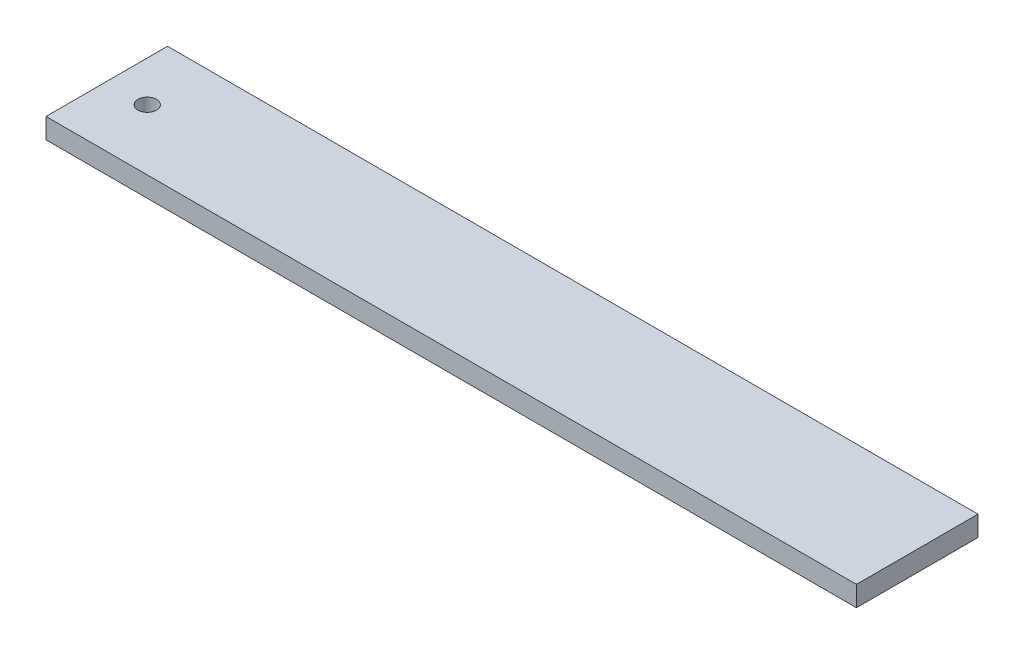
ISO-10303-21;
HEADER;
FILE_DESCRIPTION(('STEP AP214'),'2;1');
FILE_NAME('part.step','',(''),(''),'','','');
FILE_SCHEMA(('AUTOMOTIVE_DESIGN { 1 0 10303 214 1 1 1 1 }'));
ENDSEC;
DATA;
#1=APPLICATION_CONTEXT('core data for automotive mechanical design processes');
#2=APPLICATION_PROTOCOL_DEFINITION('international standard','automotive_design',2000,#1);
#3=PRODUCT_CONTEXT('',#1,'mechanical');
#4=PRODUCT('Part','Part','',(#3));
#5=PRODUCT_RELATED_PRODUCT_CATEGORY('part','',(#4));
#6=PRODUCT_DEFINITION_FORMATION('','',#4);
#7=PRODUCT_DEFINITION_CONTEXT('part definition',#1,'design');
#8=PRODUCT_DEFINITION('design','',#6,#7);
#9=PRODUCT_DEFINITION_SHAPE('','',#8);
#10=(LENGTH_UNIT() NAMED_UNIT(*) SI_UNIT(.MILLI.,.METRE.));
#11=(NAMED_UNIT(*) PLANE_ANGLE_UNIT() SI_UNIT($,.RADIAN.));
#12=(NAMED_UNIT(*) SI_UNIT($,.STERADIAN.) SOLID_ANGLE_UNIT());
#13=UNCERTAINTY_MEASURE_WITH_UNIT(LENGTH_MEASURE(1.E-05),#10,'distance_accuracy_value','');
#14=(GEOMETRIC_REPRESENTATION_CONTEXT(3) GLOBAL_UNCERTAINTY_ASSIGNED_CONTEXT((#13)) GLOBAL_UNIT_ASSIGNED_CONTEXT((#10,
#11,#12)) REPRESENTATION_CONTEXT('',''));
#15=CARTESIAN_POINT('',(0.,0.,0.));
#16=DIRECTION('',(0.,0.,1.));
#17=DIRECTION('',(1.,0.,0.));
#18=AXIS2_PLACEMENT_3D('',#15,#16,#17);
#19=CARTESIAN_POINT('',(0.,3.175,0.));
#20=DIRECTION('',(0.,-1.,0.));
#21=DIRECTION('',(0.,0.,-1.));
#22=AXIS2_PLACEMENT_3D('',#19,#20,#21);
#23=PLANE('',#22);
#24=DIRECTION('',(0.,0.,1.));
#25=VECTOR('',#24,1.);
#26=CARTESIAN_POINT('',(0.,3.175,0.));
#27=LINE('',#26,#25);
#28=CARTESIAN_POINT('',(0.,3.175,-19.05));
#29=VERTEX_POINT('',#28);
#30=CARTESIAN_POINT('',(0.,3.175,0.));
#31=VERTEX_POINT('',#30);
#32=EDGE_CURVE('E91',#29,#31,#27,.T.);
#33=ORIENTED_EDGE('',*,*,#32,.T.);
#34=DIRECTION('',(1.,0.,0.));
#35=VECTOR('',#34,1.);
#36=CARTESIAN_POINT('',(0.,3.175,0.));
#37=LINE('',#36,#35);
#38=CARTESIAN_POINT('',(127.,3.175,0.));
#39=VERTEX_POINT('',#38);
#40=EDGE_CURVE('E86',#31,#39,#37,.T.);
#41=ORIENTED_EDGE('',*,*,#40,.T.);
#42=DIRECTION('',(0.,0.,-1.));
#43=VECTOR('',#42,1.);
#44=CARTESIAN_POINT('',(127.,3.175,0.));
#45=LINE('',#44,#43);
#46=CARTESIAN_POINT('',(127.,3.175,-19.05));
#47=VERTEX_POINT('',#46);
#48=EDGE_CURVE('E89',#39,#47,#45,.T.);
#49=ORIENTED_EDGE('',*,*,#48,.T.);
#50=DIRECTION('',(-1.,0.,0.));
#51=VECTOR('',#50,1.);
#52=CARTESIAN_POINT('',(0.,3.175,-19.05));
#53=LINE('',#52,#51);
#54=EDGE_CURVE('E56',#47,#29,#53,.T.);
#55=ORIENTED_EDGE('',*,*,#54,.T.);
#56=EDGE_LOOP('',(#33,#41,#49,#55));
#57=FACE_BOUND('',#56,.T.);
#58=CARTESIAN_POINT('',(6.35,3.175,-9.525));
#59=DIRECTION('',(0.,1.,0.));
#60=DIRECTION('',(0.,0.,1.));
#61=AXIS2_PLACEMENT_3D('',#58,#59,#60);
#62=CIRCLE('',#61,1.4605);
#63=CARTESIAN_POINT('',(6.35,3.175,-8.0645));
#64=VERTEX_POINT('',#63);
#65=EDGE_CURVE('E106',#64,#64,#62,.T.);
#66=ORIENTED_EDGE('',*,*,#65,.F.);
#67=EDGE_LOOP('',(#66));
#68=FACE_BOUND('',#67,.T.);
#69=ADVANCED_FACE('F39',(#57,#68),#23,.F.);
#70=CARTESIAN_POINT('',(0.,0.,0.));
#71=DIRECTION('',(0.,-1.,0.));
#72=DIRECTION('',(0.,0.,-1.));
#73=AXIS2_PLACEMENT_3D('',#70,#71,#72);
#74=PLANE('',#73);
#75=DIRECTION('',(0.,0.,1.));
#76=VECTOR('',#75,1.);
#77=CARTESIAN_POINT('',(0.,0.,0.));
#78=LINE('',#77,#76);
#79=CARTESIAN_POINT('',(0.,0.,-19.05));
#80=VERTEX_POINT('',#79);
#81=CARTESIAN_POINT('',(0.,0.,0.));
#82=VERTEX_POINT('',#81);
#83=EDGE_CURVE('E103',#80,#82,#78,.T.);
#84=ORIENTED_EDGE('',*,*,#83,.F.);
#85=DIRECTION('',(-1.,0.,0.));
#86=VECTOR('',#85,1.);
#87=CARTESIAN_POINT('',(0.,0.,-19.05));
#88=LINE('',#87,#86);
#89=CARTESIAN_POINT('',(127.,0.,-19.05));
#90=VERTEX_POINT('',#89);
#91=EDGE_CURVE('E79',#90,#80,#88,.T.);
#92=ORIENTED_EDGE('',*,*,#91,.F.);
#93=DIRECTION('',(0.,0.,-1.));
#94=VECTOR('',#93,1.);
#95=CARTESIAN_POINT('',(127.,0.,0.));
#96=LINE('',#95,#94);
#97=CARTESIAN_POINT('',(127.,0.,0.));
#98=VERTEX_POINT('',#97);
#99=EDGE_CURVE('E73',#98,#90,#96,.T.);
#100=ORIENTED_EDGE('',*,*,#99,.F.);
#101=DIRECTION('',(1.,0.,0.));
#102=VECTOR('',#101,1.);
#103=CARTESIAN_POINT('',(0.,0.,0.));
#104=LINE('',#103,#102);
#105=EDGE_CURVE('E95',#82,#98,#104,.T.);
#106=ORIENTED_EDGE('',*,*,#105,.F.);
#107=EDGE_LOOP('',(#84,#92,#100,#106));
#108=FACE_BOUND('',#107,.T.);
#109=CARTESIAN_POINT('',(6.35,0.,-9.525));
#110=DIRECTION('',(0.,1.,0.));
#111=DIRECTION('',(0.,0.,1.));
#112=AXIS2_PLACEMENT_3D('',#109,#110,#111);
#113=CIRCLE('',#112,1.4605);
#114=CARTESIAN_POINT('',(6.35,0.,-8.0645));
#115=VERTEX_POINT('',#114);
#116=EDGE_CURVE('E118',#115,#115,#113,.T.);
#117=ORIENTED_EDGE('',*,*,#116,.T.);
#118=EDGE_LOOP('',(#117));
#119=FACE_BOUND('',#118,.T.);
#120=ADVANCED_FACE('F114',(#108,#119),#74,.T.);
#121=CARTESIAN_POINT('',(0.,3.175,0.));
#122=DIRECTION('',(1.,0.,0.));
#123=DIRECTION('',(0.,0.,-1.));
#124=AXIS2_PLACEMENT_3D('',#121,#122,#123);
#125=PLANE('',#124);
#126=ORIENTED_EDGE('',*,*,#83,.T.);
#127=DIRECTION('',(0.,-1.,0.));
#128=VECTOR('',#127,1.);
#129=CARTESIAN_POINT('',(0.,3.175,0.));
#130=LINE('',#129,#128);
#131=EDGE_CURVE('E11',#31,#82,#130,.T.);
#132=ORIENTED_EDGE('',*,*,#131,.F.);
#133=ORIENTED_EDGE('',*,*,#32,.F.);
#134=DIRECTION('',(0.,-1.,0.));
#135=VECTOR('',#134,1.);
#136=CARTESIAN_POINT('',(0.,3.175,-19.05));
#137=LINE('',#136,#135);
#138=EDGE_CURVE('E99',#29,#80,#137,.T.);
#139=ORIENTED_EDGE('',*,*,#138,.T.);
#140=EDGE_LOOP('',(#126,#132,#133,#139));
#141=FACE_BOUND('',#140,.T.);
#142=ADVANCED_FACE('F41',(#141),#125,.F.);
#143=CARTESIAN_POINT('',(0.,3.175,0.));
#144=DIRECTION('',(0.,0.,-1.));
#145=DIRECTION('',(-1.,0.,0.));
#146=AXIS2_PLACEMENT_3D('',#143,#144,#145);
#147=PLANE('',#146);
#148=ORIENTED_EDGE('',*,*,#105,.T.);
#149=DIRECTION('',(0.,-1.,0.));
#150=VECTOR('',#149,1.);
#151=CARTESIAN_POINT('',(127.,3.175,0.));
#152=LINE('',#151,#150);
#153=EDGE_CURVE('E48',#39,#98,#152,.T.);
#154=ORIENTED_EDGE('',*,*,#153,.F.);
#155=ORIENTED_EDGE('',*,*,#40,.F.);
#156=ORIENTED_EDGE('',*,*,#131,.T.);
#157=EDGE_LOOP('',(#148,#154,#155,#156));
#158=FACE_BOUND('',#157,.T.);
#159=ADVANCED_FACE('F94',(#158),#147,.F.);
#160=CARTESIAN_POINT('',(127.,3.175,0.));
#161=DIRECTION('',(-1.,0.,0.));
#162=DIRECTION('',(0.,0.,1.));
#163=AXIS2_PLACEMENT_3D('',#160,#161,#162);
#164=PLANE('',#163);
#165=ORIENTED_EDGE('',*,*,#99,.T.);
#166=DIRECTION('',(0.,-1.,0.));
#167=VECTOR('',#166,1.);
#168=CARTESIAN_POINT('',(127.,3.175,-19.05));
#169=LINE('',#168,#167);
#170=EDGE_CURVE('E96',#47,#90,#169,.T.);
#171=ORIENTED_EDGE('',*,*,#170,.F.);
#172=ORIENTED_EDGE('',*,*,#48,.F.);
#173=ORIENTED_EDGE('',*,*,#153,.T.);
#174=EDGE_LOOP('',(#165,#171,#172,#173));
#175=FACE_BOUND('',#174,.T.);
#176=ADVANCED_FACE('F97',(#175),#164,.F.);
#177=CARTESIAN_POINT('',(0.,3.175,-19.05));
#178=DIRECTION('',(0.,0.,1.));
#179=DIRECTION('',(1.,0.,0.));
#180=AXIS2_PLACEMENT_3D('',#177,#178,#179);
#181=PLANE('',#180);
#182=ORIENTED_EDGE('',*,*,#91,.T.);
#183=ORIENTED_EDGE('',*,*,#138,.F.);
#184=ORIENTED_EDGE('',*,*,#54,.F.);
#185=ORIENTED_EDGE('',*,*,#170,.T.);
#186=EDGE_LOOP('',(#182,#183,#184,#185));
#187=FACE_BOUND('',#186,.T.);
#188=ADVANCED_FACE('F111',(#187),#181,.F.);
#189=CARTESIAN_POINT('',(6.35,3.175,-9.525));
#190=DIRECTION('',(0.,-1.,0.));
#191=DIRECTION('',(0.,0.,-1.));
#192=AXIS2_PLACEMENT_3D('',#189,#190,#191);
#193=CYLINDRICAL_SURFACE('',#192,1.4605);
#194=ORIENTED_EDGE('',*,*,#65,.T.);
#195=EDGE_LOOP('',(#194));
#196=FACE_BOUND('',#195,.T.);
#197=ORIENTED_EDGE('',*,*,#116,.F.);
#198=EDGE_LOOP('',(#197));
#199=FACE_BOUND('',#198,.T.);
#200=ADVANCED_FACE('F124',(#196,#199),#193,.F.);
#201=CLOSED_SHELL('',(#69,#120,#142,#159,#176,#188,#200));
#202=MANIFOLD_SOLID_BREP('B2',#201);
#203=ADVANCED_BREP_SHAPE_REPRESENTATION('',(#18,#202),#14);
#204=SHAPE_DEFINITION_REPRESENTATION(#9,#203);
ENDSEC;
END-ISO-10303-21;
